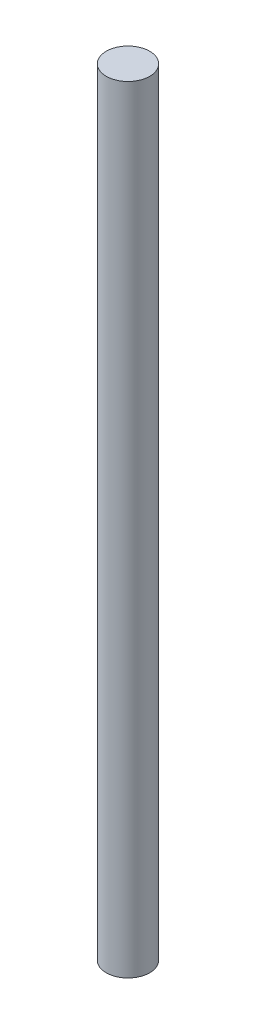
ISO-10303-21;
HEADER;
FILE_DESCRIPTION(('STEP AP214'),'2;1');
FILE_NAME('part.step','',(''),(''),'','','');
FILE_SCHEMA(('AUTOMOTIVE_DESIGN { 1 0 10303 214 1 1 1 1 }'));
ENDSEC;
DATA;
#1=APPLICATION_CONTEXT('core data for automotive mechanical design processes');
#2=APPLICATION_PROTOCOL_DEFINITION('international standard','automotive_design',2000,#1);
#3=PRODUCT_CONTEXT('',#1,'mechanical');
#4=PRODUCT('Part','Part','',(#3));
#5=PRODUCT_RELATED_PRODUCT_CATEGORY('part','',(#4));
#6=PRODUCT_DEFINITION_FORMATION('','',#4);
#7=PRODUCT_DEFINITION_CONTEXT('part definition',#1,'design');
#8=PRODUCT_DEFINITION('design','',#6,#7);
#9=PRODUCT_DEFINITION_SHAPE('','',#8);
#10=(LENGTH_UNIT() NAMED_UNIT(*) SI_UNIT(.MILLI.,.METRE.));
#11=(NAMED_UNIT(*) PLANE_ANGLE_UNIT() SI_UNIT($,.RADIAN.));
#12=(NAMED_UNIT(*) SI_UNIT($,.STERADIAN.) SOLID_ANGLE_UNIT());
#13=UNCERTAINTY_MEASURE_WITH_UNIT(LENGTH_MEASURE(1.E-05),#10,'distance_accuracy_value','');
#14=(GEOMETRIC_REPRESENTATION_CONTEXT(3) GLOBAL_UNCERTAINTY_ASSIGNED_CONTEXT((#13)) GLOBAL_UNIT_ASSIGNED_CONTEXT((#10,
#11,#12)) REPRESENTATION_CONTEXT('',''));
#15=CARTESIAN_POINT('',(0.,0.,0.));
#16=DIRECTION('',(0.,0.,1.));
#17=DIRECTION('',(1.,0.,0.));
#18=AXIS2_PLACEMENT_3D('',#15,#16,#17);
#19=CARTESIAN_POINT('',(0.,25.,0.));
#20=DIRECTION('',(0.,-1.,0.));
#21=DIRECTION('',(0.,0.,-1.));
#22=AXIS2_PLACEMENT_3D('',#19,#20,#21);
#23=CYLINDRICAL_SURFACE('',#22,0.7);
#24=CARTESIAN_POINT('',(0.,25.,0.));
#25=DIRECTION('',(0.,1.,0.));
#26=DIRECTION('',(0.,0.,1.));
#27=AXIS2_PLACEMENT_3D('',#24,#25,#26);
#28=CIRCLE('',#27,0.7);
#29=CARTESIAN_POINT('',(0.,25.,0.7));
#30=VERTEX_POINT('',#29);
#31=EDGE_CURVE('E10',#30,#30,#28,.T.);
#32=ORIENTED_EDGE('',*,*,#31,.F.);
#33=EDGE_LOOP('',(#32));
#34=FACE_BOUND('',#33,.T.);
#35=CARTESIAN_POINT('',(0.,0.,0.));
#36=DIRECTION('',(0.,1.,0.));
#37=DIRECTION('',(0.,0.,1.));
#38=AXIS2_PLACEMENT_3D('',#35,#36,#37);
#39=CIRCLE('',#38,0.7);
#40=CARTESIAN_POINT('',(0.,0.,0.7));
#41=VERTEX_POINT('',#40);
#42=EDGE_CURVE('E46',#41,#41,#39,.T.);
#43=ORIENTED_EDGE('',*,*,#42,.T.);
#44=EDGE_LOOP('',(#43));
#45=FACE_BOUND('',#44,.T.);
#46=ADVANCED_FACE('F43',(#34,#45),#23,.T.);
#47=CARTESIAN_POINT('',(0.,25.,0.));
#48=DIRECTION('',(0.,1.,0.));
#49=DIRECTION('',(0.,0.,1.));
#50=AXIS2_PLACEMENT_3D('',#47,#48,#49);
#51=PLANE('',#50);
#52=ORIENTED_EDGE('',*,*,#31,.T.);
#53=EDGE_LOOP('',(#52));
#54=FACE_BOUND('',#53,.T.);
#55=ADVANCED_FACE('F60',(#54),#51,.T.);
#56=CARTESIAN_POINT('',(0.,0.,0.));
#57=DIRECTION('',(0.,1.,0.));
#58=DIRECTION('',(0.,0.,1.));
#59=AXIS2_PLACEMENT_3D('',#56,#57,#58);
#60=PLANE('',#59);
#61=ORIENTED_EDGE('',*,*,#42,.F.);
#62=EDGE_LOOP('',(#61));
#63=FACE_BOUND('',#62,.T.);
#64=ADVANCED_FACE('F58',(#63),#60,.F.);
#65=CLOSED_SHELL('',(#46,#55,#64));
#66=MANIFOLD_SOLID_BREP('B2',#65);
#67=ADVANCED_BREP_SHAPE_REPRESENTATION('',(#18,#66),#14);
#68=SHAPE_DEFINITION_REPRESENTATION(#9,#67);
ENDSEC;
END-ISO-10303-21;
